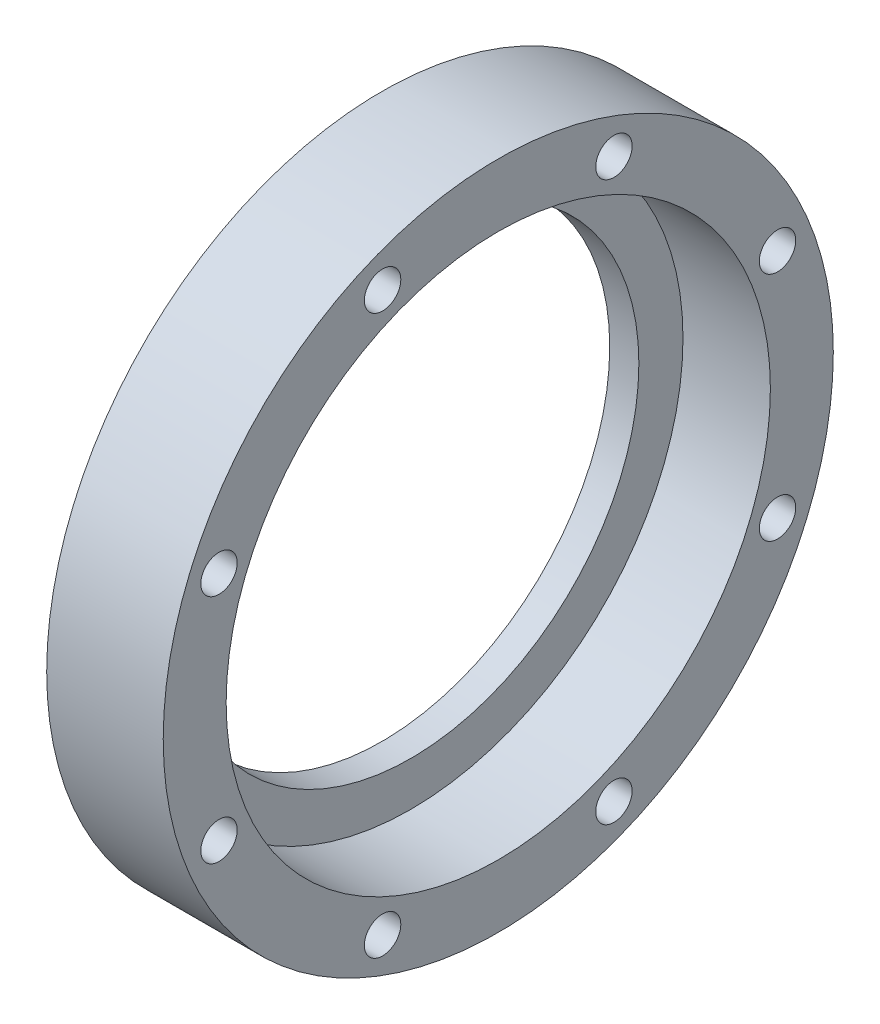
ISO-10303-21;
HEADER;
FILE_DESCRIPTION(('STEP AP214'),'2;1');
FILE_NAME('part.step','',(''),(''),'','','');
FILE_SCHEMA(('AUTOMOTIVE_DESIGN { 1 0 10303 214 1 1 1 1 }'));
ENDSEC;
DATA;
#1=APPLICATION_CONTEXT('core data for automotive mechanical design processes');
#2=APPLICATION_PROTOCOL_DEFINITION('international standard','automotive_design',2000,#1);
#3=PRODUCT_CONTEXT('',#1,'mechanical');
#4=PRODUCT('Part','Part','',(#3));
#5=PRODUCT_RELATED_PRODUCT_CATEGORY('part','',(#4));
#6=PRODUCT_DEFINITION_FORMATION('','',#4);
#7=PRODUCT_DEFINITION_CONTEXT('part definition',#1,'design');
#8=PRODUCT_DEFINITION('design','',#6,#7);
#9=PRODUCT_DEFINITION_SHAPE('','',#8);
#10=(LENGTH_UNIT() NAMED_UNIT(*) SI_UNIT(.MILLI.,.METRE.));
#11=(NAMED_UNIT(*) PLANE_ANGLE_UNIT() SI_UNIT($,.RADIAN.));
#12=(NAMED_UNIT(*) SI_UNIT($,.STERADIAN.) SOLID_ANGLE_UNIT());
#13=UNCERTAINTY_MEASURE_WITH_UNIT(LENGTH_MEASURE(1.E-05),#10,'distance_accuracy_value','');
#14=(GEOMETRIC_REPRESENTATION_CONTEXT(3) GLOBAL_UNCERTAINTY_ASSIGNED_CONTEXT((#13)) GLOBAL_UNIT_ASSIGNED_CONTEXT((#10,
#11,#12)) REPRESENTATION_CONTEXT('',''));
#15=CARTESIAN_POINT('',(0.,0.,0.));
#16=DIRECTION('',(0.,0.,1.));
#17=DIRECTION('',(1.,0.,0.));
#18=AXIS2_PLACEMENT_3D('',#15,#16,#17);
#19=CARTESIAN_POINT('',(2.,0.,0.));
#20=DIRECTION('',(-1.,0.,0.));
#21=DIRECTION('',(0.,0.,1.));
#22=AXIS2_PLACEMENT_3D('',#19,#20,#21);
#23=CYLINDRICAL_SURFACE('',#22,15.6521739130435);
#24=CARTESIAN_POINT('',(2.,0.,0.));
#25=DIRECTION('',(1.,0.,0.));
#26=DIRECTION('',(0.,0.,-1.));
#27=AXIS2_PLACEMENT_3D('',#24,#25,#26);
#28=CIRCLE('',#27,15.6521739130435);
#29=CARTESIAN_POINT('',(2.,0.,-15.6521739130435));
#30=VERTEX_POINT('',#29);
#31=EDGE_CURVE('E10',#30,#30,#28,.T.);
#32=ORIENTED_EDGE('',*,*,#31,.T.);
#33=EDGE_LOOP('',(#32));
#34=FACE_BOUND('',#33,.T.);
#35=CARTESIAN_POINT('',(0.,0.,0.));
#36=DIRECTION('',(1.,0.,0.));
#37=DIRECTION('',(0.,0.,-1.));
#38=AXIS2_PLACEMENT_3D('',#35,#36,#37);
#39=CIRCLE('',#38,15.6521739130435);
#40=CARTESIAN_POINT('',(0.,0.,-15.6521739130435));
#41=VERTEX_POINT('',#40);
#42=EDGE_CURVE('E47',#41,#41,#39,.T.);
#43=ORIENTED_EDGE('',*,*,#42,.F.);
#44=EDGE_LOOP('',(#43));
#45=FACE_BOUND('',#44,.T.);
#46=ADVANCED_FACE('F44',(#34,#45),#23,.F.);
#47=CARTESIAN_POINT('',(2.,0.,0.));
#48=DIRECTION('',(1.,0.,0.));
#49=DIRECTION('',(0.,0.,-1.));
#50=AXIS2_PLACEMENT_3D('',#47,#48,#49);
#51=PLANE('',#50);
#52=ORIENTED_EDGE('',*,*,#31,.F.);
#53=EDGE_LOOP('',(#52));
#54=FACE_BOUND('',#53,.T.);
#55=CARTESIAN_POINT('',(2.,0.,0.));
#56=DIRECTION('',(1.,0.,0.));
#57=DIRECTION('',(0.,0.,-1.));
#58=AXIS2_PLACEMENT_3D('',#55,#56,#57);
#59=CIRCLE('',#58,18.68);
#60=CARTESIAN_POINT('',(2.,0.,-18.68));
#61=VERTEX_POINT('',#60);
#62=EDGE_CURVE('E54',#61,#61,#59,.F.);
#63=ORIENTED_EDGE('',*,*,#62,.F.);
#64=EDGE_LOOP('',(#63));
#65=FACE_BOUND('',#64,.T.);
#66=ADVANCED_FACE('F150',(#54,#65),#51,.T.);
#67=CARTESIAN_POINT('',(0.,0.,0.));
#68=DIRECTION('',(1.,0.,0.));
#69=DIRECTION('',(0.,0.,-1.));
#70=AXIS2_PLACEMENT_3D('',#67,#68,#69);
#71=PLANE('',#70);
#72=ORIENTED_EDGE('',*,*,#42,.T.);
#73=EDGE_LOOP('',(#72));
#74=FACE_BOUND('',#73,.T.);
#75=CARTESIAN_POINT('',(0.,19.1705002996092,7.9406812215757));
#76=DIRECTION('',(1.,0.,0.));
#77=DIRECTION('',(0.,0.,-1.));
#78=AXIS2_PLACEMENT_3D('',#75,#76,#77);
#79=CIRCLE('',#78,1.25);
#80=CARTESIAN_POINT('',(0.,19.1705002996092,6.6906812215757));
#81=VERTEX_POINT('',#80);
#82=EDGE_CURVE('E84',#81,#81,#79,.T.);
#83=ORIENTED_EDGE('',*,*,#82,.T.);
#84=EDGE_LOOP('',(#83));
#85=FACE_BOUND('',#84,.T.);
#86=CARTESIAN_POINT('',(0.,7.94068122157552,19.1705002996092));
#87=DIRECTION('',(1.,0.,0.));
#88=DIRECTION('',(0.,0.,-1.));
#89=AXIS2_PLACEMENT_3D('',#86,#87,#88);
#90=CIRCLE('',#89,1.25);
#91=CARTESIAN_POINT('',(0.,7.94068122157552,17.9205002996092));
#92=VERTEX_POINT('',#91);
#93=EDGE_CURVE('E81',#92,#92,#90,.T.);
#94=ORIENTED_EDGE('',*,*,#93,.T.);
#95=EDGE_LOOP('',(#94));
#96=FACE_BOUND('',#95,.T.);
#97=CARTESIAN_POINT('',(0.,-7.94068122157571,19.1705002996092));
#98=DIRECTION('',(1.,0.,0.));
#99=DIRECTION('',(0.,0.,-1.));
#100=AXIS2_PLACEMENT_3D('',#97,#98,#99);
#101=CIRCLE('',#100,1.25);
#102=CARTESIAN_POINT('',(0.,-7.94068122157571,17.9205002996092));
#103=VERTEX_POINT('',#102);
#104=EDGE_CURVE('E78',#103,#103,#101,.T.);
#105=ORIENTED_EDGE('',*,*,#104,.T.);
#106=EDGE_LOOP('',(#105));
#107=FACE_BOUND('',#106,.T.);
#108=CARTESIAN_POINT('',(0.,-19.1705002996092,7.94068122157552));
#109=DIRECTION('',(1.,0.,0.));
#110=DIRECTION('',(0.,0.,-1.));
#111=AXIS2_PLACEMENT_3D('',#108,#109,#110);
#112=CIRCLE('',#111,1.25);
#113=CARTESIAN_POINT('',(0.,-19.1705002996092,6.69068122157552));
#114=VERTEX_POINT('',#113);
#115=EDGE_CURVE('E75',#114,#114,#112,.T.);
#116=ORIENTED_EDGE('',*,*,#115,.T.);
#117=EDGE_LOOP('',(#116));
#118=FACE_BOUND('',#117,.T.);
#119=CARTESIAN_POINT('',(0.,-19.1705002996092,-7.94068122157571));
#120=DIRECTION('',(1.,0.,0.));
#121=DIRECTION('',(0.,0.,-1.));
#122=AXIS2_PLACEMENT_3D('',#119,#120,#121);
#123=CIRCLE('',#122,1.25);
#124=CARTESIAN_POINT('',(0.,-19.1705002996092,-9.1906812215757));
#125=VERTEX_POINT('',#124);
#126=EDGE_CURVE('E72',#125,#125,#123,.T.);
#127=ORIENTED_EDGE('',*,*,#126,.T.);
#128=EDGE_LOOP('',(#127));
#129=FACE_BOUND('',#128,.T.);
#130=CARTESIAN_POINT('',(0.,-7.94068122157552,-19.1705002996092));
#131=DIRECTION('',(1.,0.,0.));
#132=DIRECTION('',(0.,0.,-1.));
#133=AXIS2_PLACEMENT_3D('',#130,#131,#132);
#134=CIRCLE('',#133,1.25);
#135=CARTESIAN_POINT('',(0.,-7.94068122157552,-20.4205002996092));
#136=VERTEX_POINT('',#135);
#137=EDGE_CURVE('E69',#136,#136,#134,.T.);
#138=ORIENTED_EDGE('',*,*,#137,.T.);
#139=EDGE_LOOP('',(#138));
#140=FACE_BOUND('',#139,.T.);
#141=CARTESIAN_POINT('',(0.,7.94068122157571,-19.1705002996092));
#142=DIRECTION('',(1.,0.,0.));
#143=DIRECTION('',(0.,0.,-1.));
#144=AXIS2_PLACEMENT_3D('',#141,#142,#143);
#145=CIRCLE('',#144,1.25);
#146=CARTESIAN_POINT('',(0.,7.94068122157571,-20.4205002996092));
#147=VERTEX_POINT('',#146);
#148=EDGE_CURVE('E66',#147,#147,#145,.T.);
#149=ORIENTED_EDGE('',*,*,#148,.T.);
#150=EDGE_LOOP('',(#149));
#151=FACE_BOUND('',#150,.T.);
#152=CARTESIAN_POINT('',(0.,19.1705002996092,-7.94068122157552));
#153=DIRECTION('',(1.,0.,0.));
#154=DIRECTION('',(0.,0.,-1.));
#155=AXIS2_PLACEMENT_3D('',#152,#153,#154);
#156=CIRCLE('',#155,1.25);
#157=CARTESIAN_POINT('',(0.,19.1705002996092,-9.19068122157552));
#158=VERTEX_POINT('',#157);
#159=EDGE_CURVE('E63',#158,#158,#156,.T.);
#160=ORIENTED_EDGE('',*,*,#159,.T.);
#161=EDGE_LOOP('',(#160));
#162=FACE_BOUND('',#161,.T.);
#163=CARTESIAN_POINT('',(0.,0.,0.));
#164=DIRECTION('',(1.,0.,0.));
#165=DIRECTION('',(0.,0.,-1.));
#166=AXIS2_PLACEMENT_3D('',#163,#164,#165);
#167=CIRCLE('',#166,23.);
#168=CARTESIAN_POINT('',(0.,0.,-23.));
#169=VERTEX_POINT('',#168);
#170=EDGE_CURVE('E59',#169,#169,#167,.T.);
#171=ORIENTED_EDGE('',*,*,#170,.F.);
#172=EDGE_LOOP('',(#171));
#173=FACE_BOUND('',#172,.T.);
#174=ADVANCED_FACE('F147',(#74,#85,#96,#107,#118,#129,#140,#151,#162,#173),#71,.F.);
#175=CARTESIAN_POINT('',(8.,0.,0.));
#176=DIRECTION('',(-1.,0.,0.));
#177=DIRECTION('',(0.,0.,1.));
#178=AXIS2_PLACEMENT_3D('',#175,#176,#177);
#179=CYLINDRICAL_SURFACE('',#178,18.68);
#180=ORIENTED_EDGE('',*,*,#62,.T.);
#181=EDGE_LOOP('',(#180));
#182=FACE_BOUND('',#181,.T.);
#183=CARTESIAN_POINT('',(8.,0.,0.));
#184=DIRECTION('',(1.,0.,0.));
#185=DIRECTION('',(0.,0.,-1.));
#186=AXIS2_PLACEMENT_3D('',#183,#184,#185);
#187=CIRCLE('',#186,18.68);
#188=CARTESIAN_POINT('',(8.,0.,-18.68));
#189=VERTEX_POINT('',#188);
#190=EDGE_CURVE('E89',#189,#189,#187,.T.);
#191=ORIENTED_EDGE('',*,*,#190,.T.);
#192=EDGE_LOOP('',(#191));
#193=FACE_BOUND('',#192,.T.);
#194=ADVANCED_FACE('F149',(#182,#193),#179,.F.);
#195=CARTESIAN_POINT('',(8.,19.1705002996092,-7.94068122157552));
#196=DIRECTION('',(-1.,0.,0.));
#197=DIRECTION('',(0.,0.,1.));
#198=AXIS2_PLACEMENT_3D('',#195,#196,#197);
#199=CYLINDRICAL_SURFACE('',#198,1.25);
#200=CARTESIAN_POINT('',(8.,19.1705002996092,-7.94068122157552));
#201=DIRECTION('',(1.,0.,0.));
#202=DIRECTION('',(0.,0.,-1.));
#203=AXIS2_PLACEMENT_3D('',#200,#201,#202);
#204=CIRCLE('',#203,1.25);
#205=CARTESIAN_POINT('',(8.,19.1705002996092,-9.19068122157552));
#206=VERTEX_POINT('',#205);
#207=EDGE_CURVE('E92',#206,#206,#204,.T.);
#208=ORIENTED_EDGE('',*,*,#207,.T.);
#209=EDGE_LOOP('',(#208));
#210=FACE_BOUND('',#209,.T.);
#211=ORIENTED_EDGE('',*,*,#159,.F.);
#212=EDGE_LOOP('',(#211));
#213=FACE_BOUND('',#212,.T.);
#214=ADVANCED_FACE('F156',(#210,#213),#199,.F.);
#215=CARTESIAN_POINT('',(8.,7.94068122157571,-19.1705002996092));
#216=DIRECTION('',(-1.,0.,0.));
#217=DIRECTION('',(0.,0.,1.));
#218=AXIS2_PLACEMENT_3D('',#215,#216,#217);
#219=CYLINDRICAL_SURFACE('',#218,1.25);
#220=CARTESIAN_POINT('',(8.,7.94068122157571,-19.1705002996092));
#221=DIRECTION('',(1.,0.,0.));
#222=DIRECTION('',(0.,0.,-1.));
#223=AXIS2_PLACEMENT_3D('',#220,#221,#222);
#224=CIRCLE('',#223,1.25);
#225=CARTESIAN_POINT('',(8.,7.94068122157571,-20.4205002996092));
#226=VERTEX_POINT('',#225);
#227=EDGE_CURVE('E95',#226,#226,#224,.T.);
#228=ORIENTED_EDGE('',*,*,#227,.T.);
#229=EDGE_LOOP('',(#228));
#230=FACE_BOUND('',#229,.T.);
#231=ORIENTED_EDGE('',*,*,#148,.F.);
#232=EDGE_LOOP('',(#231));
#233=FACE_BOUND('',#232,.T.);
#234=ADVANCED_FACE('F193',(#230,#233),#219,.F.);
#235=CARTESIAN_POINT('',(8.,-7.94068122157552,-19.1705002996092));
#236=DIRECTION('',(-1.,0.,0.));
#237=DIRECTION('',(0.,0.,1.));
#238=AXIS2_PLACEMENT_3D('',#235,#236,#237);
#239=CYLINDRICAL_SURFACE('',#238,1.25);
#240=CARTESIAN_POINT('',(8.,-7.94068122157552,-19.1705002996092));
#241=DIRECTION('',(1.,0.,0.));
#242=DIRECTION('',(0.,0.,-1.));
#243=AXIS2_PLACEMENT_3D('',#240,#241,#242);
#244=CIRCLE('',#243,1.25);
#245=CARTESIAN_POINT('',(8.,-7.94068122157552,-20.4205002996092));
#246=VERTEX_POINT('',#245);
#247=EDGE_CURVE('E98',#246,#246,#244,.T.);
#248=ORIENTED_EDGE('',*,*,#247,.T.);
#249=EDGE_LOOP('',(#248));
#250=FACE_BOUND('',#249,.T.);
#251=ORIENTED_EDGE('',*,*,#137,.F.);
#252=EDGE_LOOP('',(#251));
#253=FACE_BOUND('',#252,.T.);
#254=ADVANCED_FACE('F204',(#250,#253),#239,.F.);
#255=CARTESIAN_POINT('',(8.,-19.1705002996092,-7.94068122157571));
#256=DIRECTION('',(-1.,0.,0.));
#257=DIRECTION('',(0.,0.,1.));
#258=AXIS2_PLACEMENT_3D('',#255,#256,#257);
#259=CYLINDRICAL_SURFACE('',#258,1.25);
#260=CARTESIAN_POINT('',(8.,-19.1705002996092,-7.94068122157571));
#261=DIRECTION('',(1.,0.,0.));
#262=DIRECTION('',(0.,0.,-1.));
#263=AXIS2_PLACEMENT_3D('',#260,#261,#262);
#264=CIRCLE('',#263,1.25);
#265=CARTESIAN_POINT('',(8.,-19.1705002996092,-9.1906812215757));
#266=VERTEX_POINT('',#265);
#267=EDGE_CURVE('E101',#266,#266,#264,.T.);
#268=ORIENTED_EDGE('',*,*,#267,.T.);
#269=EDGE_LOOP('',(#268));
#270=FACE_BOUND('',#269,.T.);
#271=ORIENTED_EDGE('',*,*,#126,.F.);
#272=EDGE_LOOP('',(#271));
#273=FACE_BOUND('',#272,.T.);
#274=ADVANCED_FACE('F215',(#270,#273),#259,.F.);
#275=CARTESIAN_POINT('',(8.,-19.1705002996092,7.94068122157552));
#276=DIRECTION('',(-1.,0.,0.));
#277=DIRECTION('',(0.,0.,1.));
#278=AXIS2_PLACEMENT_3D('',#275,#276,#277);
#279=CYLINDRICAL_SURFACE('',#278,1.25);
#280=CARTESIAN_POINT('',(8.,-19.1705002996092,7.94068122157552));
#281=DIRECTION('',(1.,0.,0.));
#282=DIRECTION('',(0.,0.,-1.));
#283=AXIS2_PLACEMENT_3D('',#280,#281,#282);
#284=CIRCLE('',#283,1.25);
#285=CARTESIAN_POINT('',(8.,-19.1705002996092,6.69068122157552));
#286=VERTEX_POINT('',#285);
#287=EDGE_CURVE('E104',#286,#286,#284,.T.);
#288=ORIENTED_EDGE('',*,*,#287,.T.);
#289=EDGE_LOOP('',(#288));
#290=FACE_BOUND('',#289,.T.);
#291=ORIENTED_EDGE('',*,*,#115,.F.);
#292=EDGE_LOOP('',(#291));
#293=FACE_BOUND('',#292,.T.);
#294=ADVANCED_FACE('F226',(#290,#293),#279,.F.);
#295=CARTESIAN_POINT('',(8.,-7.94068122157571,19.1705002996092));
#296=DIRECTION('',(-1.,0.,0.));
#297=DIRECTION('',(0.,0.,1.));
#298=AXIS2_PLACEMENT_3D('',#295,#296,#297);
#299=CYLINDRICAL_SURFACE('',#298,1.25);
#300=CARTESIAN_POINT('',(8.,-7.94068122157571,19.1705002996092));
#301=DIRECTION('',(1.,0.,0.));
#302=DIRECTION('',(0.,0.,-1.));
#303=AXIS2_PLACEMENT_3D('',#300,#301,#302);
#304=CIRCLE('',#303,1.25);
#305=CARTESIAN_POINT('',(8.,-7.94068122157571,17.9205002996092));
#306=VERTEX_POINT('',#305);
#307=EDGE_CURVE('E107',#306,#306,#304,.T.);
#308=ORIENTED_EDGE('',*,*,#307,.T.);
#309=EDGE_LOOP('',(#308));
#310=FACE_BOUND('',#309,.T.);
#311=ORIENTED_EDGE('',*,*,#104,.F.);
#312=EDGE_LOOP('',(#311));
#313=FACE_BOUND('',#312,.T.);
#314=ADVANCED_FACE('F237',(#310,#313),#299,.F.);
#315=CARTESIAN_POINT('',(8.,7.94068122157552,19.1705002996092));
#316=DIRECTION('',(-1.,0.,0.));
#317=DIRECTION('',(0.,0.,1.));
#318=AXIS2_PLACEMENT_3D('',#315,#316,#317);
#319=CYLINDRICAL_SURFACE('',#318,1.25);
#320=CARTESIAN_POINT('',(8.,7.94068122157552,19.1705002996092));
#321=DIRECTION('',(1.,0.,0.));
#322=DIRECTION('',(0.,0.,-1.));
#323=AXIS2_PLACEMENT_3D('',#320,#321,#322);
#324=CIRCLE('',#323,1.25);
#325=CARTESIAN_POINT('',(8.,7.94068122157552,17.9205002996092));
#326=VERTEX_POINT('',#325);
#327=EDGE_CURVE('E110',#326,#326,#324,.T.);
#328=ORIENTED_EDGE('',*,*,#327,.T.);
#329=EDGE_LOOP('',(#328));
#330=FACE_BOUND('',#329,.T.);
#331=ORIENTED_EDGE('',*,*,#93,.F.);
#332=EDGE_LOOP('',(#331));
#333=FACE_BOUND('',#332,.T.);
#334=ADVANCED_FACE('F248',(#330,#333),#319,.F.);
#335=CARTESIAN_POINT('',(8.,19.1705002996092,7.9406812215757));
#336=DIRECTION('',(-1.,0.,0.));
#337=DIRECTION('',(0.,0.,1.));
#338=AXIS2_PLACEMENT_3D('',#335,#336,#337);
#339=CYLINDRICAL_SURFACE('',#338,1.25);
#340=CARTESIAN_POINT('',(8.,19.1705002996092,7.9406812215757));
#341=DIRECTION('',(1.,0.,0.));
#342=DIRECTION('',(0.,0.,-1.));
#343=AXIS2_PLACEMENT_3D('',#340,#341,#342);
#344=CIRCLE('',#343,1.25);
#345=CARTESIAN_POINT('',(8.,19.1705002996092,6.6906812215757));
#346=VERTEX_POINT('',#345);
#347=EDGE_CURVE('E62',#346,#346,#344,.T.);
#348=ORIENTED_EDGE('',*,*,#347,.T.);
#349=EDGE_LOOP('',(#348));
#350=FACE_BOUND('',#349,.T.);
#351=ORIENTED_EDGE('',*,*,#82,.F.);
#352=EDGE_LOOP('',(#351));
#353=FACE_BOUND('',#352,.T.);
#354=ADVANCED_FACE('F116',(#350,#353),#339,.F.);
#355=CARTESIAN_POINT('',(8.,0.,0.));
#356=DIRECTION('',(-1.,0.,0.));
#357=DIRECTION('',(0.,0.,1.));
#358=AXIS2_PLACEMENT_3D('',#355,#356,#357);
#359=CYLINDRICAL_SURFACE('',#358,23.);
#360=CARTESIAN_POINT('',(8.,0.,0.));
#361=DIRECTION('',(1.,0.,0.));
#362=DIRECTION('',(0.,0.,-1.));
#363=AXIS2_PLACEMENT_3D('',#360,#361,#362);
#364=CIRCLE('',#363,23.);
#365=CARTESIAN_POINT('',(8.,0.,-23.));
#366=VERTEX_POINT('',#365);
#367=EDGE_CURVE('E58',#366,#366,#364,.T.);
#368=ORIENTED_EDGE('',*,*,#367,.F.);
#369=EDGE_LOOP('',(#368));
#370=FACE_BOUND('',#369,.T.);
#371=ORIENTED_EDGE('',*,*,#170,.T.);
#372=EDGE_LOOP('',(#371));
#373=FACE_BOUND('',#372,.T.);
#374=ADVANCED_FACE('F122',(#370,#373),#359,.T.);
#375=CARTESIAN_POINT('',(8.,0.,0.));
#376=DIRECTION('',(1.,0.,0.));
#377=DIRECTION('',(0.,0.,-1.));
#378=AXIS2_PLACEMENT_3D('',#375,#376,#377);
#379=PLANE('',#378);
#380=ORIENTED_EDGE('',*,*,#347,.F.);
#381=EDGE_LOOP('',(#380));
#382=FACE_BOUND('',#381,.T.);
#383=ORIENTED_EDGE('',*,*,#327,.F.);
#384=EDGE_LOOP('',(#383));
#385=FACE_BOUND('',#384,.T.);
#386=ORIENTED_EDGE('',*,*,#307,.F.);
#387=EDGE_LOOP('',(#386));
#388=FACE_BOUND('',#387,.T.);
#389=ORIENTED_EDGE('',*,*,#287,.F.);
#390=EDGE_LOOP('',(#389));
#391=FACE_BOUND('',#390,.T.);
#392=ORIENTED_EDGE('',*,*,#267,.F.);
#393=EDGE_LOOP('',(#392));
#394=FACE_BOUND('',#393,.T.);
#395=ORIENTED_EDGE('',*,*,#247,.F.);
#396=EDGE_LOOP('',(#395));
#397=FACE_BOUND('',#396,.T.);
#398=ORIENTED_EDGE('',*,*,#227,.F.);
#399=EDGE_LOOP('',(#398));
#400=FACE_BOUND('',#399,.T.);
#401=ORIENTED_EDGE('',*,*,#207,.F.);
#402=EDGE_LOOP('',(#401));
#403=FACE_BOUND('',#402,.T.);
#404=ORIENTED_EDGE('',*,*,#190,.F.);
#405=EDGE_LOOP('',(#404));
#406=FACE_BOUND('',#405,.T.);
#407=ORIENTED_EDGE('',*,*,#367,.T.);
#408=EDGE_LOOP('',(#407));
#409=FACE_BOUND('',#408,.T.);
#410=ADVANCED_FACE('F119',(#382,#385,#388,#391,#394,#397,#400,#403,#406,#409),#379,.T.);
#411=CLOSED_SHELL('',(#46,#66,#174,#194,#214,#234,#254,#274,#294,#314,#334,#354,#374,#410));
#412=MANIFOLD_SOLID_BREP('B2',#411);
#413=ADVANCED_BREP_SHAPE_REPRESENTATION('',(#18,#412),#14);
#414=SHAPE_DEFINITION_REPRESENTATION(#9,#413);
ENDSEC;
END-ISO-10303-21;
